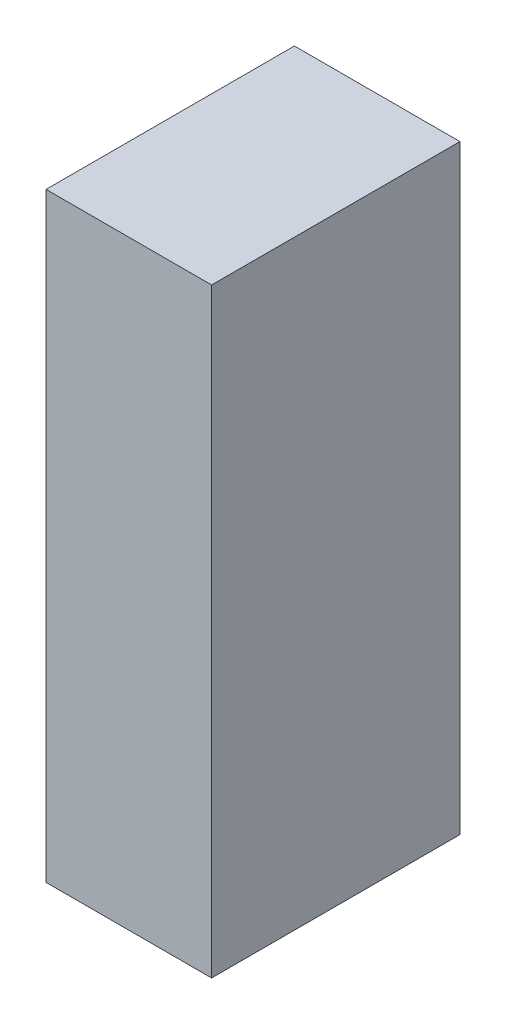
ISO-10303-21;
HEADER;
FILE_DESCRIPTION(('STEP AP214'),'2;1');
FILE_NAME('part.step','',(''),(''),'','','');
FILE_SCHEMA(('AUTOMOTIVE_DESIGN { 1 0 10303 214 1 1 1 1 }'));
ENDSEC;
DATA;
#1=APPLICATION_CONTEXT('core data for automotive mechanical design processes');
#2=APPLICATION_PROTOCOL_DEFINITION('international standard','automotive_design',2000,#1);
#3=PRODUCT_CONTEXT('',#1,'mechanical');
#4=PRODUCT('Part','Part','',(#3));
#5=PRODUCT_RELATED_PRODUCT_CATEGORY('part','',(#4));
#6=PRODUCT_DEFINITION_FORMATION('','',#4);
#7=PRODUCT_DEFINITION_CONTEXT('part definition',#1,'design');
#8=PRODUCT_DEFINITION('design','',#6,#7);
#9=PRODUCT_DEFINITION_SHAPE('','',#8);
#10=(LENGTH_UNIT() NAMED_UNIT(*) SI_UNIT(.MILLI.,.METRE.));
#11=(NAMED_UNIT(*) PLANE_ANGLE_UNIT() SI_UNIT($,.RADIAN.));
#12=(NAMED_UNIT(*) SI_UNIT($,.STERADIAN.) SOLID_ANGLE_UNIT());
#13=UNCERTAINTY_MEASURE_WITH_UNIT(LENGTH_MEASURE(1.E-05),#10,'distance_accuracy_value','');
#14=(GEOMETRIC_REPRESENTATION_CONTEXT(3) GLOBAL_UNCERTAINTY_ASSIGNED_CONTEXT((#13)) GLOBAL_UNIT_ASSIGNED_CONTEXT((#10,
#11,#12)) REPRESENTATION_CONTEXT('',''));
#15=CARTESIAN_POINT('',(0.,0.,0.));
#16=DIRECTION('',(0.,0.,1.));
#17=DIRECTION('',(1.,0.,0.));
#18=AXIS2_PLACEMENT_3D('',#15,#16,#17);
#19=CARTESIAN_POINT('',(0.700037372092652,0.725000131906988,0.));
#20=DIRECTION('',(-1.,8.74227765734759E-08,0.));
#21=DIRECTION('',(-8.74227765734759E-08,-1.,0.));
#22=AXIS2_PLACEMENT_3D('',#19,#20,#21);
#23=PLANE('',#22);
#24=DIRECTION('',(-8.74227766086187E-08,-0.999999999999996,0.));
#25=VECTOR('',#24,1.);
#26=CARTESIAN_POINT('',(0.700037372092652,0.725000131906988,0.));
#27=LINE('',#26,#25);
#28=CARTESIAN_POINT('',(0.700037372092652,0.725000131906988,0.));
#29=VERTEX_POINT('',#28);
#30=CARTESIAN_POINT('',(0.700037245329895,-0.724996816335199,0.));
#31=VERTEX_POINT('',#30);
#32=EDGE_CURVE('E11',#29,#31,#27,.T.);
#33=ORIENTED_EDGE('',*,*,#32,.T.);
#34=DIRECTION('',(0.,0.,1.));
#35=VECTOR('',#34,1.);
#36=CARTESIAN_POINT('',(0.700037245329893,-0.724996816335199,0.));
#37=LINE('',#36,#35);
#38=CARTESIAN_POINT('',(0.700037245329895,-0.724996816335199,0.599998772144318));
#39=VERTEX_POINT('',#38);
#40=EDGE_CURVE('E88',#31,#39,#37,.T.);
#41=ORIENTED_EDGE('',*,*,#40,.T.);
#42=DIRECTION('',(-8.74227766086187E-08,-0.999999999999996,0.));
#43=VECTOR('',#42,1.);
#44=CARTESIAN_POINT('',(0.700037372092652,0.725000131906988,0.599998772144318));
#45=LINE('',#44,#43);
#46=CARTESIAN_POINT('',(0.700037372092652,0.725000131906988,0.599998772144318));
#47=VERTEX_POINT('',#46);
#48=EDGE_CURVE('E83',#47,#39,#45,.T.);
#49=ORIENTED_EDGE('',*,*,#48,.F.);
#50=DIRECTION('',(0.,0.,1.));
#51=VECTOR('',#50,1.);
#52=CARTESIAN_POINT('',(0.700037372092652,0.72500013190699,0.));
#53=LINE('',#52,#51);
#54=EDGE_CURVE('E72',#29,#47,#53,.T.);
#55=ORIENTED_EDGE('',*,*,#54,.F.);
#56=EDGE_LOOP('',(#33,#41,#49,#55));
#57=FACE_BOUND('',#56,.T.);
#58=ADVANCED_FACE('F17',(#57),#23,.T.);
#59=CARTESIAN_POINT('',(0.700037245329895,-0.724996816335199,0.));
#60=DIRECTION('',(-8.74227765734758E-08,-1.,0.));
#61=DIRECTION('',(1.,-8.74227765734758E-08,0.));
#62=AXIS2_PLACEMENT_3D('',#59,#60,#61);
#63=PLANE('',#62);
#64=DIRECTION('',(0.999999999999996,-8.74227764368535E-08,0.));
#65=VECTOR('',#64,1.);
#66=CARTESIAN_POINT('',(0.700037245329895,-0.724996816335199,0.));
#67=LINE('',#66,#65);
#68=CARTESIAN_POINT('',(1.10000062423615,-0.724996851301107,0.));
#69=VERTEX_POINT('',#68);
#70=EDGE_CURVE('E24',#31,#69,#67,.T.);
#71=ORIENTED_EDGE('',*,*,#70,.T.);
#72=DIRECTION('',(0.,0.,1.));
#73=VECTOR('',#72,1.);
#74=CARTESIAN_POINT('',(1.10000062423615,-0.724996851301108,0.));
#75=LINE('',#74,#73);
#76=CARTESIAN_POINT('',(1.10000062423615,-0.724996851301107,0.599998772144318));
#77=VERTEX_POINT('',#76);
#78=EDGE_CURVE('E85',#69,#77,#75,.T.);
#79=ORIENTED_EDGE('',*,*,#78,.T.);
#80=DIRECTION('',(0.999999999999996,-8.74227764368535E-08,0.));
#81=VECTOR('',#80,1.);
#82=CARTESIAN_POINT('',(0.700037245329895,-0.724996816335199,0.599998772144318));
#83=LINE('',#82,#81);
#84=EDGE_CURVE('E66',#39,#77,#83,.T.);
#85=ORIENTED_EDGE('',*,*,#84,.F.);
#86=ORIENTED_EDGE('',*,*,#40,.F.);
#87=EDGE_LOOP('',(#71,#79,#85,#86));
#88=FACE_BOUND('',#87,.T.);
#89=ADVANCED_FACE('F89',(#88),#63,.T.);
#90=CARTESIAN_POINT('',(1.10000062423615,-0.724996851301107,0.));
#91=DIRECTION('',(1.,-8.74227765734759E-08,0.));
#92=DIRECTION('',(8.74227765734759E-08,1.,0.));
#93=AXIS2_PLACEMENT_3D('',#90,#91,#92);
#94=PLANE('',#93);
#95=DIRECTION('',(8.74227765320514E-08,0.999999999999996,0.));
#96=VECTOR('',#95,1.);
#97=CARTESIAN_POINT('',(1.10000062423615,-0.724996851301107,0.));
#98=LINE('',#97,#96);
#99=CARTESIAN_POINT('',(1.1000007509989,0.725000096941081,0.));
#100=VERTEX_POINT('',#99);
#101=EDGE_CURVE('E62',#69,#100,#98,.T.);
#102=ORIENTED_EDGE('',*,*,#101,.T.);
#103=DIRECTION('',(0.,0.,1.));
#104=VECTOR('',#103,1.);
#105=CARTESIAN_POINT('',(1.1000007509989,0.725000096941081,0.));
#106=LINE('',#105,#104);
#107=CARTESIAN_POINT('',(1.1000007509989,0.725000096941081,0.599998772144318));
#108=VERTEX_POINT('',#107);
#109=EDGE_CURVE('E55',#100,#108,#106,.T.);
#110=ORIENTED_EDGE('',*,*,#109,.T.);
#111=DIRECTION('',(8.74227765320514E-08,0.999999999999996,0.));
#112=VECTOR('',#111,1.);
#113=CARTESIAN_POINT('',(1.10000062423615,-0.724996851301107,0.599998772144318));
#114=LINE('',#113,#112);
#115=EDGE_CURVE('E59',#77,#108,#114,.T.);
#116=ORIENTED_EDGE('',*,*,#115,.F.);
#117=ORIENTED_EDGE('',*,*,#78,.F.);
#118=EDGE_LOOP('',(#102,#110,#116,#117));
#119=FACE_BOUND('',#118,.T.);
#120=ADVANCED_FACE('F57',(#119),#94,.T.);
#121=CARTESIAN_POINT('',(1.1000007509989,0.725000096941081,0.));
#122=DIRECTION('',(8.74227765734758E-08,1.,0.));
#123=DIRECTION('',(-1.,8.74227765734758E-08,0.));
#124=AXIS2_PLACEMENT_3D('',#121,#122,#123);
#125=PLANE('',#124);
#126=DIRECTION('',(-0.999999999999996,8.74227764368536E-08,0.));
#127=VECTOR('',#126,1.);
#128=CARTESIAN_POINT('',(1.1000007509989,0.725000096941081,0.));
#129=LINE('',#128,#127);
#130=EDGE_CURVE('E65',#100,#29,#129,.T.);
#131=ORIENTED_EDGE('',*,*,#130,.T.);
#132=ORIENTED_EDGE('',*,*,#54,.T.);
#133=DIRECTION('',(-0.999999999999996,8.74227764368536E-08,0.));
#134=VECTOR('',#133,1.);
#135=CARTESIAN_POINT('',(1.1000007509989,0.725000096941081,0.599998772144318));
#136=LINE('',#135,#134);
#137=EDGE_CURVE('E70',#108,#47,#136,.T.);
#138=ORIENTED_EDGE('',*,*,#137,.F.);
#139=ORIENTED_EDGE('',*,*,#109,.F.);
#140=EDGE_LOOP('',(#131,#132,#138,#139));
#141=FACE_BOUND('',#140,.T.);
#142=ADVANCED_FACE('F71',(#141),#125,.T.);
#143=CARTESIAN_POINT('',(412.378356933594,61.9506187438965,0.599998772144318));
#144=DIRECTION('',(0.,0.,1.));
#145=DIRECTION('',(-1.,8.74227765734759E-08,0.));
#146=AXIS2_PLACEMENT_3D('',#143,#144,#145);
#147=PLANE('',#146);
#148=ORIENTED_EDGE('',*,*,#48,.T.);
#149=ORIENTED_EDGE('',*,*,#84,.T.);
#150=ORIENTED_EDGE('',*,*,#115,.T.);
#151=ORIENTED_EDGE('',*,*,#137,.T.);
#152=EDGE_LOOP('',(#148,#149,#150,#151));
#153=FACE_BOUND('',#152,.T.);
#154=ADVANCED_FACE('F76',(#153),#147,.T.);
#155=CARTESIAN_POINT('',(412.378356933594,61.9506187438965,0.));
#156=DIRECTION('',(0.,0.,1.));
#157=DIRECTION('',(-1.,8.74227765734759E-08,0.));
#158=AXIS2_PLACEMENT_3D('',#155,#156,#157);
#159=PLANE('',#158);
#160=ORIENTED_EDGE('',*,*,#130,.F.);
#161=ORIENTED_EDGE('',*,*,#101,.F.);
#162=ORIENTED_EDGE('',*,*,#70,.F.);
#163=ORIENTED_EDGE('',*,*,#32,.F.);
#164=EDGE_LOOP('',(#160,#161,#162,#163));
#165=FACE_BOUND('',#164,.T.);
#166=ADVANCED_FACE('F91',(#165),#159,.F.);
#167=CLOSED_SHELL('',(#58,#89,#120,#142,#154,#166));
#168=MANIFOLD_SOLID_BREP('B1',#167);
#169=ADVANCED_BREP_SHAPE_REPRESENTATION('',(#18,#168),#14);
#170=SHAPE_DEFINITION_REPRESENTATION(#9,#169);
ENDSEC;
END-ISO-10303-21;
